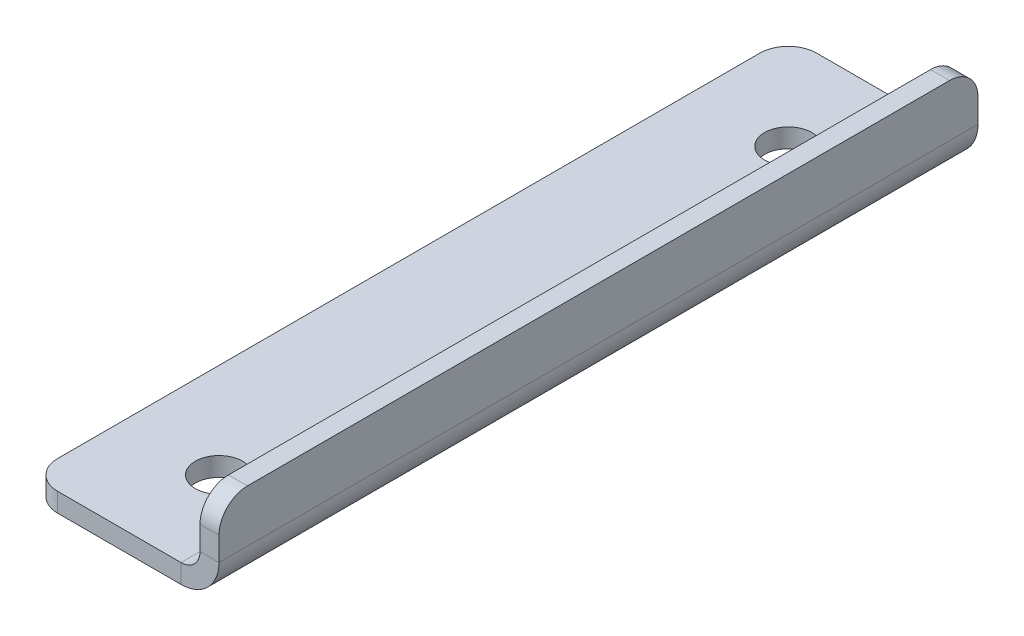
ISO-10303-21;
HEADER;
FILE_DESCRIPTION(('STEP AP214'),'2;1');
FILE_NAME('part.step','',(''),(''),'','','');
FILE_SCHEMA(('AUTOMOTIVE_DESIGN { 1 0 10303 214 1 1 1 1 }'));
ENDSEC;
DATA;
#1=APPLICATION_CONTEXT('core data for automotive mechanical design processes');
#2=APPLICATION_PROTOCOL_DEFINITION('international standard','automotive_design',2000,#1);
#3=PRODUCT_CONTEXT('',#1,'mechanical');
#4=PRODUCT('Part','Part','',(#3));
#5=PRODUCT_RELATED_PRODUCT_CATEGORY('part','',(#4));
#6=PRODUCT_DEFINITION_FORMATION('','',#4);
#7=PRODUCT_DEFINITION_CONTEXT('part definition',#1,'design');
#8=PRODUCT_DEFINITION('design','',#6,#7);
#9=PRODUCT_DEFINITION_SHAPE('','',#8);
#10=(LENGTH_UNIT() NAMED_UNIT(*) SI_UNIT(.MILLI.,.METRE.));
#11=(NAMED_UNIT(*) PLANE_ANGLE_UNIT() SI_UNIT($,.RADIAN.));
#12=(NAMED_UNIT(*) SI_UNIT($,.STERADIAN.) SOLID_ANGLE_UNIT());
#13=UNCERTAINTY_MEASURE_WITH_UNIT(LENGTH_MEASURE(1.E-05),#10,'distance_accuracy_value','');
#14=(GEOMETRIC_REPRESENTATION_CONTEXT(3) GLOBAL_UNCERTAINTY_ASSIGNED_CONTEXT((#13)) GLOBAL_UNIT_ASSIGNED_CONTEXT((#10,
#11,#12)) REPRESENTATION_CONTEXT('',''));
#15=CARTESIAN_POINT('',(0.,0.,0.));
#16=DIRECTION('',(0.,0.,1.));
#17=DIRECTION('',(1.,0.,0.));
#18=AXIS2_PLACEMENT_3D('',#15,#16,#17);
#19=CARTESIAN_POINT('',(10.,2.,40.));
#20=DIRECTION('',(0.,0.,-1.));
#21=DIRECTION('',(-1.,0.,0.));
#22=AXIS2_PLACEMENT_3D('',#19,#20,#21);
#23=PLANE('',#22);
#24=DIRECTION('',(1.,0.,0.));
#25=VECTOR('',#24,1.);
#26=CARTESIAN_POINT('',(10.,2.,40.));
#27=LINE('',#26,#25);
#28=CARTESIAN_POINT('',(-7.,2.,40.));
#29=VERTEX_POINT('',#28);
#30=CARTESIAN_POINT('',(6.00000000000001,2.,40.));
#31=VERTEX_POINT('',#30);
#32=EDGE_CURVE('E233',#29,#31,#27,.T.);
#33=ORIENTED_EDGE('',*,*,#32,.F.);
#34=DIRECTION('',(0.,-1.,0.));
#35=VECTOR('',#34,1.);
#36=CARTESIAN_POINT('',(-7.,2.,40.));
#37=LINE('',#36,#35);
#38=CARTESIAN_POINT('',(-7.,0.,40.));
#39=VERTEX_POINT('',#38);
#40=EDGE_CURVE('E73',#29,#39,#37,.T.);
#41=ORIENTED_EDGE('',*,*,#40,.T.);
#42=DIRECTION('',(1.,0.,0.));
#43=VECTOR('',#42,1.);
#44=CARTESIAN_POINT('',(10.,0.,40.));
#45=LINE('',#44,#43);
#46=CARTESIAN_POINT('',(6.00000000000001,0.,40.));
#47=VERTEX_POINT('',#46);
#48=EDGE_CURVE('E245',#39,#47,#45,.T.);
#49=ORIENTED_EDGE('',*,*,#48,.T.);
#50=DIRECTION('',(0.,-1.,0.));
#51=VECTOR('',#50,1.);
#52=CARTESIAN_POINT('',(6.00000000000001,2.,40.));
#53=LINE('',#52,#51);
#54=EDGE_CURVE('E222',#31,#47,#53,.T.);
#55=ORIENTED_EDGE('',*,*,#54,.F.);
#56=EDGE_LOOP('',(#33,#41,#49,#55));
#57=FACE_BOUND('',#56,.T.);
#58=ADVANCED_FACE('F64',(#57),#23,.F.);
#59=CARTESIAN_POINT('',(10.,2.,-40.));
#60=DIRECTION('',(0.,0.,1.));
#61=DIRECTION('',(1.,0.,0.));
#62=AXIS2_PLACEMENT_3D('',#59,#60,#61);
#63=PLANE('',#62);
#64=DIRECTION('',(-1.,0.,0.));
#65=VECTOR('',#64,1.);
#66=CARTESIAN_POINT('',(10.,0.,-40.));
#67=LINE('',#66,#65);
#68=CARTESIAN_POINT('',(6.00000000000001,0.,-40.));
#69=VERTEX_POINT('',#68);
#70=CARTESIAN_POINT('',(-7.00000000000001,0.,-40.));
#71=VERTEX_POINT('',#70);
#72=EDGE_CURVE('E234',#69,#71,#67,.T.);
#73=ORIENTED_EDGE('',*,*,#72,.T.);
#74=DIRECTION('',(0.,-1.,0.));
#75=VECTOR('',#74,1.);
#76=CARTESIAN_POINT('',(-7.00000000000001,2.,-40.));
#77=LINE('',#76,#75);
#78=CARTESIAN_POINT('',(-7.00000000000001,2.,-40.));
#79=VERTEX_POINT('',#78);
#80=EDGE_CURVE('E263',#71,#79,#77,.F.);
#81=ORIENTED_EDGE('',*,*,#80,.T.);
#82=DIRECTION('',(-1.,0.,0.));
#83=VECTOR('',#82,1.);
#84=CARTESIAN_POINT('',(10.,2.,-40.));
#85=LINE('',#84,#83);
#86=CARTESIAN_POINT('',(6.00000000000001,2.,-40.));
#87=VERTEX_POINT('',#86);
#88=EDGE_CURVE('E237',#87,#79,#85,.T.);
#89=ORIENTED_EDGE('',*,*,#88,.F.);
#90=DIRECTION('',(0.,-1.,0.));
#91=VECTOR('',#90,1.);
#92=CARTESIAN_POINT('',(6.00000000000001,2.,-40.));
#93=LINE('',#92,#91);
#94=EDGE_CURVE('E211',#87,#69,#93,.T.);
#95=ORIENTED_EDGE('',*,*,#94,.T.);
#96=EDGE_LOOP('',(#73,#81,#89,#95));
#97=FACE_BOUND('',#96,.T.);
#98=ADVANCED_FACE('F316',(#97),#63,.F.);
#99=CARTESIAN_POINT('',(0.,2.,0.));
#100=DIRECTION('',(0.,1.,0.));
#101=DIRECTION('',(0.,0.,1.));
#102=AXIS2_PLACEMENT_3D('',#99,#100,#101);
#103=PLANE('',#102);
#104=CARTESIAN_POINT('',(0.,2.,-30.));
#105=DIRECTION('',(0.,1.,0.));
#106=DIRECTION('',(0.,0.,1.));
#107=AXIS2_PLACEMENT_3D('',#104,#105,#106);
#108=CIRCLE('',#107,2.49999999999999);
#109=CARTESIAN_POINT('',(0.,2.,-27.5));
#110=VERTEX_POINT('',#109);
#111=EDGE_CURVE('E455',#110,#110,#108,.T.);
#112=ORIENTED_EDGE('',*,*,#111,.F.);
#113=EDGE_LOOP('',(#112));
#114=FACE_BOUND('',#113,.T.);
#115=CARTESIAN_POINT('',(0.,2.,30.));
#116=DIRECTION('',(0.,1.,0.));
#117=DIRECTION('',(0.,0.,1.));
#118=AXIS2_PLACEMENT_3D('',#115,#116,#117);
#119=CIRCLE('',#118,2.49999999999999);
#120=CARTESIAN_POINT('',(0.,2.,32.5));
#121=VERTEX_POINT('',#120);
#122=EDGE_CURVE('E397',#121,#121,#119,.T.);
#123=ORIENTED_EDGE('',*,*,#122,.F.);
#124=EDGE_LOOP('',(#123));
#125=FACE_BOUND('',#124,.T.);
#126=ORIENTED_EDGE('',*,*,#88,.T.);
#127=CARTESIAN_POINT('',(-7.00000000000001,2.,-37.));
#128=DIRECTION('',(0.,1.,0.));
#129=DIRECTION('',(0.,0.,1.));
#130=AXIS2_PLACEMENT_3D('',#127,#128,#129);
#131=CIRCLE('',#130,3.);
#132=CARTESIAN_POINT('',(-10.,2.,-37.));
#133=VERTEX_POINT('',#132);
#134=EDGE_CURVE('E269',#79,#133,#131,.T.);
#135=ORIENTED_EDGE('',*,*,#134,.T.);
#136=DIRECTION('',(0.,0.,1.));
#137=VECTOR('',#136,1.);
#138=CARTESIAN_POINT('',(-10.,2.,40.));
#139=LINE('',#138,#137);
#140=CARTESIAN_POINT('',(-10.,2.,37.));
#141=VERTEX_POINT('',#140);
#142=EDGE_CURVE('E229',#133,#141,#139,.T.);
#143=ORIENTED_EDGE('',*,*,#142,.T.);
#144=CARTESIAN_POINT('',(-7.,2.,37.));
#145=DIRECTION('',(0.,1.,0.));
#146=DIRECTION('',(0.,0.,1.));
#147=AXIS2_PLACEMENT_3D('',#144,#145,#146);
#148=CIRCLE('',#147,3.);
#149=EDGE_CURVE('E266',#141,#29,#148,.T.);
#150=ORIENTED_EDGE('',*,*,#149,.T.);
#151=ORIENTED_EDGE('',*,*,#32,.T.);
#152=DIRECTION('',(0.,0.,-1.));
#153=VECTOR('',#152,1.);
#154=CARTESIAN_POINT('',(6.00000000000001,2.,-40.));
#155=LINE('',#154,#153);
#156=EDGE_CURVE('E216',#87,#31,#155,.F.);
#157=ORIENTED_EDGE('',*,*,#156,.F.);
#158=EDGE_LOOP('',(#126,#135,#143,#150,#151,#157));
#159=FACE_BOUND('',#158,.T.);
#160=ADVANCED_FACE('F313',(#114,#125,#159),#103,.T.);
#161=CARTESIAN_POINT('',(0.,0.,0.));
#162=DIRECTION('',(0.,1.,0.));
#163=DIRECTION('',(0.,0.,1.));
#164=AXIS2_PLACEMENT_3D('',#161,#162,#163);
#165=PLANE('',#164);
#166=CARTESIAN_POINT('',(0.,0.,-30.));
#167=DIRECTION('',(0.,1.,0.));
#168=DIRECTION('',(0.,0.,1.));
#169=AXIS2_PLACEMENT_3D('',#166,#167,#168);
#170=CIRCLE('',#169,2.5);
#171=CARTESIAN_POINT('',(0.,0.,-27.5));
#172=VERTEX_POINT('',#171);
#173=EDGE_CURVE('E393',#172,#172,#170,.T.);
#174=ORIENTED_EDGE('',*,*,#173,.T.);
#175=EDGE_LOOP('',(#174));
#176=FACE_BOUND('',#175,.T.);
#177=CARTESIAN_POINT('',(0.,0.,30.));
#178=DIRECTION('',(0.,1.,0.));
#179=DIRECTION('',(0.,0.,1.));
#180=AXIS2_PLACEMENT_3D('',#177,#178,#179);
#181=CIRCLE('',#180,2.5);
#182=CARTESIAN_POINT('',(0.,0.,32.5));
#183=VERTEX_POINT('',#182);
#184=EDGE_CURVE('E206',#183,#183,#181,.T.);
#185=ORIENTED_EDGE('',*,*,#184,.T.);
#186=EDGE_LOOP('',(#185));
#187=FACE_BOUND('',#186,.T.);
#188=DIRECTION('',(0.,0.,1.));
#189=VECTOR('',#188,1.);
#190=CARTESIAN_POINT('',(-10.,0.,40.));
#191=LINE('',#190,#189);
#192=CARTESIAN_POINT('',(-10.,0.,-37.));
#193=VERTEX_POINT('',#192);
#194=CARTESIAN_POINT('',(-10.,0.,37.));
#195=VERTEX_POINT('',#194);
#196=EDGE_CURVE('E226',#193,#195,#191,.T.);
#197=ORIENTED_EDGE('',*,*,#196,.F.);
#198=CARTESIAN_POINT('',(-7.00000000000001,0.,-37.));
#199=DIRECTION('',(0.,1.,0.));
#200=DIRECTION('',(0.,0.,1.));
#201=AXIS2_PLACEMENT_3D('',#198,#199,#200);
#202=CIRCLE('',#201,3.);
#203=EDGE_CURVE('E260',#193,#71,#202,.F.);
#204=ORIENTED_EDGE('',*,*,#203,.T.);
#205=ORIENTED_EDGE('',*,*,#72,.F.);
#206=DIRECTION('',(0.,0.,-1.));
#207=VECTOR('',#206,1.);
#208=CARTESIAN_POINT('',(6.00000000000001,0.,-40.));
#209=LINE('',#208,#207);
#210=EDGE_CURVE('E175',#69,#47,#209,.F.);
#211=ORIENTED_EDGE('',*,*,#210,.T.);
#212=ORIENTED_EDGE('',*,*,#48,.F.);
#213=CARTESIAN_POINT('',(-7.,0.,37.));
#214=DIRECTION('',(0.,1.,0.));
#215=DIRECTION('',(0.,0.,1.));
#216=AXIS2_PLACEMENT_3D('',#213,#214,#215);
#217=CIRCLE('',#216,3.);
#218=EDGE_CURVE('E257',#39,#195,#217,.F.);
#219=ORIENTED_EDGE('',*,*,#218,.T.);
#220=EDGE_LOOP('',(#197,#204,#205,#211,#212,#219));
#221=FACE_BOUND('',#220,.T.);
#222=ADVANCED_FACE('F303',(#176,#187,#221),#165,.F.);
#223=CARTESIAN_POINT('',(-10.,2.,40.));
#224=DIRECTION('',(1.,0.,0.));
#225=DIRECTION('',(0.,0.,-1.));
#226=AXIS2_PLACEMENT_3D('',#223,#224,#225);
#227=PLANE('',#226);
#228=ORIENTED_EDGE('',*,*,#142,.F.);
#229=DIRECTION('',(0.,-1.,0.));
#230=VECTOR('',#229,1.);
#231=CARTESIAN_POINT('',(-10.,2.,-37.));
#232=LINE('',#231,#230);
#233=EDGE_CURVE('E253',#133,#193,#232,.T.);
#234=ORIENTED_EDGE('',*,*,#233,.T.);
#235=ORIENTED_EDGE('',*,*,#196,.T.);
#236=DIRECTION('',(0.,-1.,0.));
#237=VECTOR('',#236,1.);
#238=CARTESIAN_POINT('',(-10.,2.,37.));
#239=LINE('',#238,#237);
#240=EDGE_CURVE('E241',#195,#141,#239,.F.);
#241=ORIENTED_EDGE('',*,*,#240,.T.);
#242=EDGE_LOOP('',(#228,#234,#235,#241));
#243=FACE_BOUND('',#242,.T.);
#244=ADVANCED_FACE('F323',(#243),#227,.F.);
#245=CARTESIAN_POINT('',(6.00000000000001,4.,40.));
#246=DIRECTION('',(0.,0.,1.));
#247=DIRECTION('',(1.,0.,0.));
#248=AXIS2_PLACEMENT_3D('',#245,#246,#247);
#249=PLANE('',#248);
#250=DIRECTION('',(1.,0.,0.));
#251=VECTOR('',#250,1.);
#252=CARTESIAN_POINT('',(10.,3.99999999999999,40.));
#253=LINE('',#252,#251);
#254=CARTESIAN_POINT('',(8.00000000000001,3.99999999999999,40.));
#255=VERTEX_POINT('',#254);
#256=CARTESIAN_POINT('',(10.,3.99999999999999,40.));
#257=VERTEX_POINT('',#256);
#258=EDGE_CURVE('E202',#255,#257,#253,.T.);
#259=ORIENTED_EDGE('',*,*,#258,.F.);
#260=CARTESIAN_POINT('',(6.00000000000001,4.,40.));
#261=DIRECTION('',(0.,0.,-1.));
#262=DIRECTION('',(-1.,0.,0.));
#263=AXIS2_PLACEMENT_3D('',#260,#261,#262);
#264=CIRCLE('',#263,2.);
#265=EDGE_CURVE('E179',#31,#255,#264,.F.);
#266=ORIENTED_EDGE('',*,*,#265,.F.);
#267=ORIENTED_EDGE('',*,*,#54,.T.);
#268=CARTESIAN_POINT('',(6.00000000000001,4.,40.));
#269=DIRECTION('',(0.,0.,-1.));
#270=DIRECTION('',(-1.,0.,0.));
#271=AXIS2_PLACEMENT_3D('',#268,#269,#270);
#272=CIRCLE('',#271,4.);
#273=EDGE_CURVE('E209',#47,#257,#272,.F.);
#274=ORIENTED_EDGE('',*,*,#273,.T.);
#275=EDGE_LOOP('',(#259,#266,#267,#274));
#276=FACE_BOUND('',#275,.T.);
#277=ADVANCED_FACE('F307',(#276),#249,.T.);
#278=CARTESIAN_POINT('',(6.00000000000001,4.,-40.));
#279=DIRECTION('',(0.,0.,1.));
#280=DIRECTION('',(1.,0.,0.));
#281=AXIS2_PLACEMENT_3D('',#278,#279,#280);
#282=PLANE('',#281);
#283=CARTESIAN_POINT('',(6.00000000000001,4.,-40.));
#284=DIRECTION('',(0.,0.,-1.));
#285=DIRECTION('',(-1.,0.,0.));
#286=AXIS2_PLACEMENT_3D('',#283,#284,#285);
#287=CIRCLE('',#286,2.);
#288=CARTESIAN_POINT('',(8.00000000000001,3.99999999999999,-40.));
#289=VERTEX_POINT('',#288);
#290=EDGE_CURVE('E163',#289,#87,#287,.T.);
#291=ORIENTED_EDGE('',*,*,#290,.F.);
#292=DIRECTION('',(1.,0.,0.));
#293=VECTOR('',#292,1.);
#294=CARTESIAN_POINT('',(8.00000000000001,3.99999999999999,-40.));
#295=LINE('',#294,#293);
#296=CARTESIAN_POINT('',(10.,3.99999999999999,-40.));
#297=VERTEX_POINT('',#296);
#298=EDGE_CURVE('E159',#289,#297,#295,.T.);
#299=ORIENTED_EDGE('',*,*,#298,.T.);
#300=CARTESIAN_POINT('',(6.00000000000001,4.,-40.));
#301=DIRECTION('',(0.,0.,-1.));
#302=DIRECTION('',(-1.,0.,0.));
#303=AXIS2_PLACEMENT_3D('',#300,#301,#302);
#304=CIRCLE('',#303,4.);
#305=EDGE_CURVE('E169',#297,#69,#304,.T.);
#306=ORIENTED_EDGE('',*,*,#305,.T.);
#307=ORIENTED_EDGE('',*,*,#94,.F.);
#308=EDGE_LOOP('',(#291,#299,#306,#307));
#309=FACE_BOUND('',#308,.T.);
#310=ADVANCED_FACE('F182',(#309),#282,.F.);
#311=CARTESIAN_POINT('',(6.00000000000001,4.,-40.));
#312=DIRECTION('',(0.,0.,-1.));
#313=DIRECTION('',(1.,0.,0.));
#314=AXIS2_PLACEMENT_3D('',#311,#312,#313);
#315=CYLINDRICAL_SURFACE('',#314,4.);
#316=ORIENTED_EDGE('',*,*,#210,.F.);
#317=ORIENTED_EDGE('',*,*,#305,.F.);
#318=DIRECTION('',(0.,0.,-1.));
#319=VECTOR('',#318,1.);
#320=CARTESIAN_POINT('',(10.,3.99999999999999,0.));
#321=LINE('',#320,#319);
#322=EDGE_CURVE('E172',#257,#297,#321,.T.);
#323=ORIENTED_EDGE('',*,*,#322,.F.);
#324=ORIENTED_EDGE('',*,*,#273,.F.);
#325=EDGE_LOOP('',(#316,#317,#323,#324));
#326=FACE_BOUND('',#325,.T.);
#327=ADVANCED_FACE('F170',(#326),#315,.T.);
#328=CARTESIAN_POINT('',(6.00000000000001,4.,-40.));
#329=DIRECTION('',(0.,0.,-1.));
#330=DIRECTION('',(1.,0.,0.));
#331=AXIS2_PLACEMENT_3D('',#328,#329,#330);
#332=CYLINDRICAL_SURFACE('',#331,2.);
#333=ORIENTED_EDGE('',*,*,#156,.T.);
#334=ORIENTED_EDGE('',*,*,#265,.T.);
#335=DIRECTION('',(0.,0.,1.));
#336=VECTOR('',#335,1.);
#337=CARTESIAN_POINT('',(8.00000000000001,3.99999999999999,40.));
#338=LINE('',#337,#336);
#339=EDGE_CURVE('E185',#255,#289,#338,.F.);
#340=ORIENTED_EDGE('',*,*,#339,.T.);
#341=ORIENTED_EDGE('',*,*,#290,.T.);
#342=EDGE_LOOP('',(#333,#334,#340,#341));
#343=FACE_BOUND('',#342,.T.);
#344=ADVANCED_FACE('F309',(#343),#332,.F.);
#345=CARTESIAN_POINT('',(10.,1.99999999999999,-40.));
#346=DIRECTION('',(0.,0.,-1.));
#347=DIRECTION('',(-1.,0.,0.));
#348=AXIS2_PLACEMENT_3D('',#345,#346,#347);
#349=PLANE('',#348);
#350=DIRECTION('',(0.,1.,0.));
#351=VECTOR('',#350,1.);
#352=CARTESIAN_POINT('',(7.99999999999999,0.,-40.));
#353=LINE('',#352,#351);
#354=CARTESIAN_POINT('',(8.00000000000001,6.50000000000001,-40.));
#355=VERTEX_POINT('',#354);
#356=EDGE_CURVE('E410',#355,#289,#353,.F.);
#357=ORIENTED_EDGE('',*,*,#356,.F.);
#358=DIRECTION('',(-1.,0.,0.));
#359=VECTOR('',#358,1.);
#360=CARTESIAN_POINT('',(10.,6.5,-40.));
#361=LINE('',#360,#359);
#362=CARTESIAN_POINT('',(10.,6.5,-40.));
#363=VERTEX_POINT('',#362);
#364=EDGE_CURVE('E88',#355,#363,#361,.F.);
#365=ORIENTED_EDGE('',*,*,#364,.T.);
#366=DIRECTION('',(0.,-1.,0.));
#367=VECTOR('',#366,1.);
#368=CARTESIAN_POINT('',(10.,1.99999999999999,-40.));
#369=LINE('',#368,#367);
#370=EDGE_CURVE('E155',#363,#297,#369,.T.);
#371=ORIENTED_EDGE('',*,*,#370,.T.);
#372=ORIENTED_EDGE('',*,*,#298,.F.);
#373=EDGE_LOOP('',(#357,#365,#371,#372));
#374=FACE_BOUND('',#373,.T.);
#375=ADVANCED_FACE('F157',(#374),#349,.T.);
#376=CARTESIAN_POINT('',(10.,9.5,40.));
#377=DIRECTION('',(0.,0.,1.));
#378=DIRECTION('',(1.,0.,0.));
#379=AXIS2_PLACEMENT_3D('',#376,#377,#378);
#380=PLANE('',#379);
#381=DIRECTION('',(0.,1.,0.));
#382=VECTOR('',#381,1.);
#383=CARTESIAN_POINT('',(10.,9.5,40.));
#384=LINE('',#383,#382);
#385=CARTESIAN_POINT('',(10.,6.5,40.));
#386=VERTEX_POINT('',#385);
#387=EDGE_CURVE('E188',#257,#386,#384,.T.);
#388=ORIENTED_EDGE('',*,*,#387,.T.);
#389=DIRECTION('',(-1.,0.,0.));
#390=VECTOR('',#389,1.);
#391=CARTESIAN_POINT('',(10.,6.5,40.));
#392=LINE('',#391,#390);
#393=CARTESIAN_POINT('',(8.00000000000001,6.50000000000001,40.));
#394=VERTEX_POINT('',#393);
#395=EDGE_CURVE('E13',#386,#394,#392,.T.);
#396=ORIENTED_EDGE('',*,*,#395,.T.);
#397=DIRECTION('',(0.,-1.,0.));
#398=VECTOR('',#397,1.);
#399=CARTESIAN_POINT('',(7.99999999999999,0.,40.));
#400=LINE('',#399,#398);
#401=EDGE_CURVE('E190',#255,#394,#400,.F.);
#402=ORIENTED_EDGE('',*,*,#401,.F.);
#403=ORIENTED_EDGE('',*,*,#258,.T.);
#404=EDGE_LOOP('',(#388,#396,#402,#403));
#405=FACE_BOUND('',#404,.T.);
#406=ADVANCED_FACE('F366',(#405),#380,.T.);
#407=CARTESIAN_POINT('',(9.99999999999999,0.,0.));
#408=DIRECTION('',(1.,0.,0.));
#409=DIRECTION('',(0.,1.,0.));
#410=AXIS2_PLACEMENT_3D('',#407,#408,#409);
#411=PLANE('',#410);
#412=ORIENTED_EDGE('',*,*,#370,.F.);
#413=CARTESIAN_POINT('',(10.,6.5,-37.));
#414=DIRECTION('',(1.,0.,0.));
#415=DIRECTION('',(0.,1.,0.));
#416=AXIS2_PLACEMENT_3D('',#413,#414,#415);
#417=CIRCLE('',#416,3.);
#418=CARTESIAN_POINT('',(10.,9.5,-37.));
#419=VERTEX_POINT('',#418);
#420=EDGE_CURVE('E289',#363,#419,#417,.T.);
#421=ORIENTED_EDGE('',*,*,#420,.T.);
#422=DIRECTION('',(0.,0.,-1.));
#423=VECTOR('',#422,1.);
#424=CARTESIAN_POINT('',(10.,9.5,-40.));
#425=LINE('',#424,#423);
#426=CARTESIAN_POINT('',(10.,9.5,37.));
#427=VERTEX_POINT('',#426);
#428=EDGE_CURVE('E164',#427,#419,#425,.T.);
#429=ORIENTED_EDGE('',*,*,#428,.F.);
#430=CARTESIAN_POINT('',(10.,6.5,37.));
#431=DIRECTION('',(1.,0.,0.));
#432=DIRECTION('',(0.,1.,0.));
#433=AXIS2_PLACEMENT_3D('',#430,#431,#432);
#434=CIRCLE('',#433,3.);
#435=EDGE_CURVE('E80',#427,#386,#434,.T.);
#436=ORIENTED_EDGE('',*,*,#435,.T.);
#437=ORIENTED_EDGE('',*,*,#387,.F.);
#438=ORIENTED_EDGE('',*,*,#322,.T.);
#439=EDGE_LOOP('',(#412,#421,#429,#436,#437,#438));
#440=FACE_BOUND('',#439,.T.);
#441=ADVANCED_FACE('F187',(#440),#411,.T.);
#442=CARTESIAN_POINT('',(7.99999999999999,0.,0.));
#443=DIRECTION('',(1.,0.,0.));
#444=DIRECTION('',(0.,1.,0.));
#445=AXIS2_PLACEMENT_3D('',#442,#443,#444);
#446=PLANE('',#445);
#447=DIRECTION('',(0.,0.,1.));
#448=VECTOR('',#447,1.);
#449=CARTESIAN_POINT('',(8.00000000000002,9.50000000000001,0.));
#450=LINE('',#449,#448);
#451=CARTESIAN_POINT('',(8.00000000000002,9.50000000000001,37.));
#452=VERTEX_POINT('',#451);
#453=CARTESIAN_POINT('',(8.00000000000002,9.50000000000001,-37.));
#454=VERTEX_POINT('',#453);
#455=EDGE_CURVE('E195',#452,#454,#450,.F.);
#456=ORIENTED_EDGE('',*,*,#455,.T.);
#457=CARTESIAN_POINT('',(8.00000000000001,6.50000000000001,-37.));
#458=DIRECTION('',(1.,0.,0.));
#459=DIRECTION('',(0.,1.,0.));
#460=AXIS2_PLACEMENT_3D('',#457,#458,#459);
#461=CIRCLE('',#460,3.);
#462=EDGE_CURVE('E282',#454,#355,#461,.F.);
#463=ORIENTED_EDGE('',*,*,#462,.T.);
#464=ORIENTED_EDGE('',*,*,#356,.T.);
#465=ORIENTED_EDGE('',*,*,#339,.F.);
#466=ORIENTED_EDGE('',*,*,#401,.T.);
#467=CARTESIAN_POINT('',(8.00000000000001,6.50000000000001,37.));
#468=DIRECTION('',(1.,0.,0.));
#469=DIRECTION('',(0.,1.,0.));
#470=AXIS2_PLACEMENT_3D('',#467,#468,#469);
#471=CIRCLE('',#470,3.);
#472=EDGE_CURVE('E279',#394,#452,#471,.F.);
#473=ORIENTED_EDGE('',*,*,#472,.T.);
#474=EDGE_LOOP('',(#456,#463,#464,#465,#466,#473));
#475=FACE_BOUND('',#474,.T.);
#476=ADVANCED_FACE('F365',(#475),#446,.F.);
#477=CARTESIAN_POINT('',(10.,9.5,-40.));
#478=DIRECTION('',(0.,1.,0.));
#479=DIRECTION('',(-1.,0.,0.));
#480=AXIS2_PLACEMENT_3D('',#477,#478,#479);
#481=PLANE('',#480);
#482=ORIENTED_EDGE('',*,*,#428,.T.);
#483=DIRECTION('',(-1.,0.,0.));
#484=VECTOR('',#483,1.);
#485=CARTESIAN_POINT('',(10.,9.5,-37.));
#486=LINE('',#485,#484);
#487=EDGE_CURVE('E275',#419,#454,#486,.T.);
#488=ORIENTED_EDGE('',*,*,#487,.T.);
#489=ORIENTED_EDGE('',*,*,#455,.F.);
#490=DIRECTION('',(-1.,0.,0.));
#491=VECTOR('',#490,1.);
#492=CARTESIAN_POINT('',(10.,9.5,37.));
#493=LINE('',#492,#491);
#494=EDGE_CURVE('E272',#452,#427,#493,.F.);
#495=ORIENTED_EDGE('',*,*,#494,.T.);
#496=EDGE_LOOP('',(#482,#488,#489,#495));
#497=FACE_BOUND('',#496,.T.);
#498=ADVANCED_FACE('F357',(#497),#481,.T.);
#499=CARTESIAN_POINT('',(0.,2.,30.));
#500=DIRECTION('',(0.,1.,0.));
#501=DIRECTION('',(0.,0.,1.));
#502=AXIS2_PLACEMENT_3D('',#499,#500,#501);
#503=CYLINDRICAL_SURFACE('',#502,2.49999999999999);
#504=ORIENTED_EDGE('',*,*,#184,.F.);
#505=EDGE_LOOP('',(#504));
#506=FACE_BOUND('',#505,.T.);
#507=ORIENTED_EDGE('',*,*,#122,.T.);
#508=EDGE_LOOP('',(#507));
#509=FACE_BOUND('',#508,.T.);
#510=ADVANCED_FACE('F351',(#506,#509),#503,.F.);
#511=CARTESIAN_POINT('',(0.,2.,-30.));
#512=DIRECTION('',(0.,1.,0.));
#513=DIRECTION('',(0.,0.,1.));
#514=AXIS2_PLACEMENT_3D('',#511,#512,#513);
#515=CYLINDRICAL_SURFACE('',#514,2.49999999999999);
#516=ORIENTED_EDGE('',*,*,#173,.F.);
#517=EDGE_LOOP('',(#516));
#518=FACE_BOUND('',#517,.T.);
#519=ORIENTED_EDGE('',*,*,#111,.T.);
#520=EDGE_LOOP('',(#519));
#521=FACE_BOUND('',#520,.T.);
#522=ADVANCED_FACE('F347',(#518,#521),#515,.F.);
#523=CARTESIAN_POINT('',(-7.00000000000001,2.,-37.));
#524=DIRECTION('',(0.,-1.,0.));
#525=DIRECTION('',(0.,0.,-1.));
#526=AXIS2_PLACEMENT_3D('',#523,#524,#525);
#527=CYLINDRICAL_SURFACE('',#526,3.);
#528=ORIENTED_EDGE('',*,*,#134,.F.);
#529=ORIENTED_EDGE('',*,*,#80,.F.);
#530=ORIENTED_EDGE('',*,*,#203,.F.);
#531=ORIENTED_EDGE('',*,*,#233,.F.);
#532=EDGE_LOOP('',(#528,#529,#530,#531));
#533=FACE_BOUND('',#532,.T.);
#534=ADVANCED_FACE('F319',(#533),#527,.T.);
#535=CARTESIAN_POINT('',(10.,6.5,-37.));
#536=DIRECTION('',(-1.,0.,0.));
#537=DIRECTION('',(0.,-1.,0.));
#538=AXIS2_PLACEMENT_3D('',#535,#536,#537);
#539=CYLINDRICAL_SURFACE('',#538,3.);
#540=ORIENTED_EDGE('',*,*,#420,.F.);
#541=ORIENTED_EDGE('',*,*,#364,.F.);
#542=ORIENTED_EDGE('',*,*,#462,.F.);
#543=ORIENTED_EDGE('',*,*,#487,.F.);
#544=EDGE_LOOP('',(#540,#541,#542,#543));
#545=FACE_BOUND('',#544,.T.);
#546=ADVANCED_FACE('F327',(#545),#539,.T.);
#547=CARTESIAN_POINT('',(-7.,2.,37.));
#548=DIRECTION('',(0.,-1.,0.));
#549=DIRECTION('',(0.,0.,-1.));
#550=AXIS2_PLACEMENT_3D('',#547,#548,#549);
#551=CYLINDRICAL_SURFACE('',#550,3.);
#552=ORIENTED_EDGE('',*,*,#149,.F.);
#553=ORIENTED_EDGE('',*,*,#240,.F.);
#554=ORIENTED_EDGE('',*,*,#218,.F.);
#555=ORIENTED_EDGE('',*,*,#40,.F.);
#556=EDGE_LOOP('',(#552,#553,#554,#555));
#557=FACE_BOUND('',#556,.T.);
#558=ADVANCED_FACE('F325',(#557),#551,.T.);
#559=CARTESIAN_POINT('',(10.,6.5,37.));
#560=DIRECTION('',(-1.,0.,0.));
#561=DIRECTION('',(0.,-1.,0.));
#562=AXIS2_PLACEMENT_3D('',#559,#560,#561);
#563=CYLINDRICAL_SURFACE('',#562,3.);
#564=ORIENTED_EDGE('',*,*,#435,.F.);
#565=ORIENTED_EDGE('',*,*,#494,.F.);
#566=ORIENTED_EDGE('',*,*,#472,.F.);
#567=ORIENTED_EDGE('',*,*,#395,.F.);
#568=EDGE_LOOP('',(#564,#565,#566,#567));
#569=FACE_BOUND('',#568,.T.);
#570=ADVANCED_FACE('F66',(#569),#563,.T.);
#571=CLOSED_SHELL('',(#58,#98,#160,#222,#244,#277,#310,#327,#344,#375,#406,#441,#476,#498,#510,
#522,#534,#546,#558,#570));
#572=MANIFOLD_SOLID_BREP('B2',#571);
#573=ADVANCED_BREP_SHAPE_REPRESENTATION('',(#18,#572),#14);
#574=SHAPE_DEFINITION_REPRESENTATION(#9,#573);
ENDSEC;
END-ISO-10303-21;
